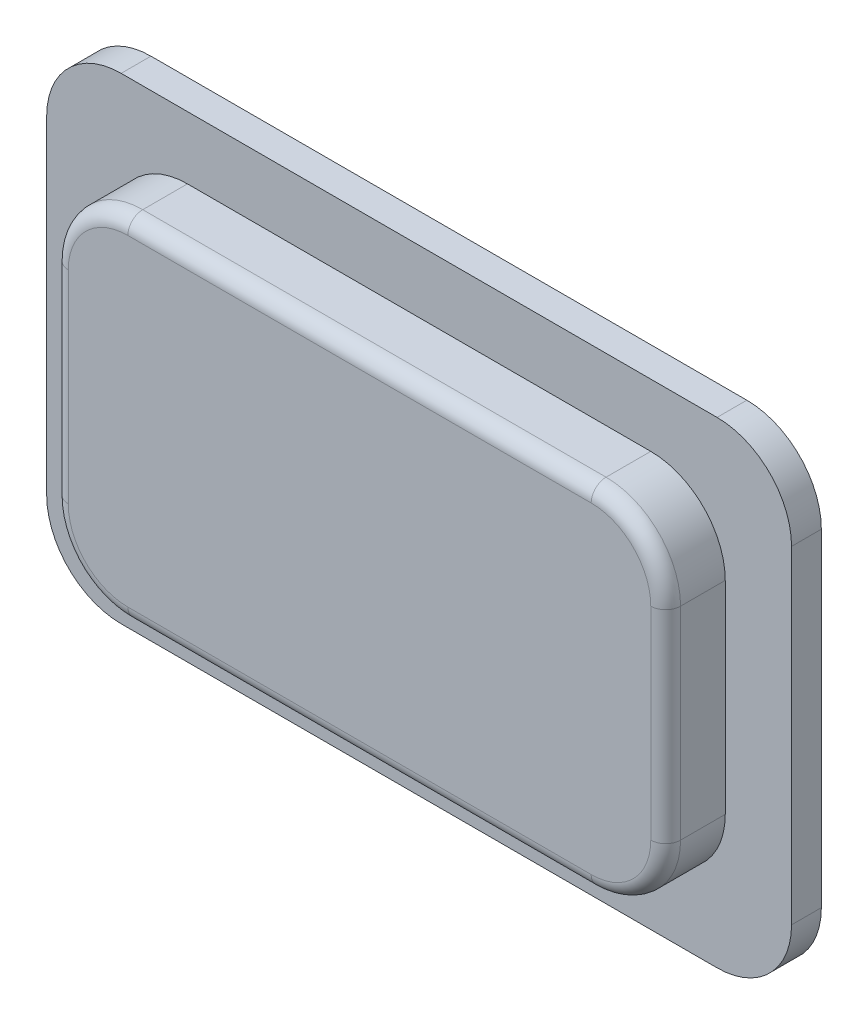
ISO-10303-21;
HEADER;
FILE_DESCRIPTION(('STEP AP214'),'2;1');
FILE_NAME('part.step','',(''),(''),'','','');
FILE_SCHEMA(('AUTOMOTIVE_DESIGN { 1 0 10303 214 1 1 1 1 }'));
ENDSEC;
DATA;
#1=APPLICATION_CONTEXT('core data for automotive mechanical design processes');
#2=APPLICATION_PROTOCOL_DEFINITION('international standard','automotive_design',2000,#1);
#3=PRODUCT_CONTEXT('',#1,'mechanical');
#4=PRODUCT('Part','Part','',(#3));
#5=PRODUCT_RELATED_PRODUCT_CATEGORY('part','',(#4));
#6=PRODUCT_DEFINITION_FORMATION('','',#4);
#7=PRODUCT_DEFINITION_CONTEXT('part definition',#1,'design');
#8=PRODUCT_DEFINITION('design','',#6,#7);
#9=PRODUCT_DEFINITION_SHAPE('','',#8);
#10=(LENGTH_UNIT() NAMED_UNIT(*) SI_UNIT(.MILLI.,.METRE.));
#11=(NAMED_UNIT(*) PLANE_ANGLE_UNIT() SI_UNIT($,.RADIAN.));
#12=(NAMED_UNIT(*) SI_UNIT($,.STERADIAN.) SOLID_ANGLE_UNIT());
#13=UNCERTAINTY_MEASURE_WITH_UNIT(LENGTH_MEASURE(1.E-05),#10,'distance_accuracy_value','');
#14=(GEOMETRIC_REPRESENTATION_CONTEXT(3) GLOBAL_UNCERTAINTY_ASSIGNED_CONTEXT((#13)) GLOBAL_UNIT_ASSIGNED_CONTEXT((#10,
#11,#12)) REPRESENTATION_CONTEXT('',''));
#15=CARTESIAN_POINT('',(0.,0.,0.));
#16=DIRECTION('',(0.,0.,1.));
#17=DIRECTION('',(1.,0.,0.));
#18=AXIS2_PLACEMENT_3D('',#15,#16,#17);
#19=CARTESIAN_POINT('',(0.,0.,0.));
#20=DIRECTION('',(0.,0.,-1.));
#21=DIRECTION('',(-1.,0.,0.));
#22=AXIS2_PLACEMENT_3D('',#19,#20,#21);
#23=PLANE('',#22);
#24=DIRECTION('',(0.,-1.,0.));
#25=VECTOR('',#24,1.);
#26=CARTESIAN_POINT('',(-12.5,-8.,0.));
#27=LINE('',#26,#25);
#28=CARTESIAN_POINT('',(-12.5,5.5,0.));
#29=VERTEX_POINT('',#28);
#30=CARTESIAN_POINT('',(-12.5,-5.5,0.));
#31=VERTEX_POINT('',#30);
#32=EDGE_CURVE('E175',#29,#31,#27,.T.);
#33=ORIENTED_EDGE('',*,*,#32,.T.);
#34=CARTESIAN_POINT('',(-10.,-5.5,0.));
#35=DIRECTION('',(0.,0.,-1.));
#36=DIRECTION('',(-1.,0.,0.));
#37=AXIS2_PLACEMENT_3D('',#34,#35,#36);
#38=CIRCLE('',#37,2.5);
#39=CARTESIAN_POINT('',(-10.,-8.,0.));
#40=VERTEX_POINT('',#39);
#41=EDGE_CURVE('E182',#31,#40,#38,.F.);
#42=ORIENTED_EDGE('',*,*,#41,.T.);
#43=DIRECTION('',(1.,0.,0.));
#44=VECTOR('',#43,1.);
#45=CARTESIAN_POINT('',(-12.5,-8.,0.));
#46=LINE('',#45,#44);
#47=CARTESIAN_POINT('',(10.,-8.,0.));
#48=VERTEX_POINT('',#47);
#49=EDGE_CURVE('E193',#40,#48,#46,.T.);
#50=ORIENTED_EDGE('',*,*,#49,.T.);
#51=CARTESIAN_POINT('',(10.,-5.5,0.));
#52=DIRECTION('',(0.,0.,-1.));
#53=DIRECTION('',(-1.,0.,0.));
#54=AXIS2_PLACEMENT_3D('',#51,#52,#53);
#55=CIRCLE('',#54,2.5);
#56=CARTESIAN_POINT('',(12.5,-5.5,0.));
#57=VERTEX_POINT('',#56);
#58=EDGE_CURVE('E200',#48,#57,#55,.F.);
#59=ORIENTED_EDGE('',*,*,#58,.T.);
#60=DIRECTION('',(0.,1.,0.));
#61=VECTOR('',#60,1.);
#62=CARTESIAN_POINT('',(12.5,-8.,0.));
#63=LINE('',#62,#61);
#64=CARTESIAN_POINT('',(12.5,5.5,0.));
#65=VERTEX_POINT('',#64);
#66=EDGE_CURVE('E327',#57,#65,#63,.T.);
#67=ORIENTED_EDGE('',*,*,#66,.T.);
#68=CARTESIAN_POINT('',(10.,5.5,0.));
#69=DIRECTION('',(0.,0.,-1.));
#70=DIRECTION('',(-1.,0.,0.));
#71=AXIS2_PLACEMENT_3D('',#68,#69,#70);
#72=CIRCLE('',#71,2.5);
#73=CARTESIAN_POINT('',(10.,8.,0.));
#74=VERTEX_POINT('',#73);
#75=EDGE_CURVE('E183',#65,#74,#72,.F.);
#76=ORIENTED_EDGE('',*,*,#75,.T.);
#77=DIRECTION('',(-1.,0.,0.));
#78=VECTOR('',#77,1.);
#79=CARTESIAN_POINT('',(-12.5,8.,0.));
#80=LINE('',#79,#78);
#81=CARTESIAN_POINT('',(-10.,8.,0.));
#82=VERTEX_POINT('',#81);
#83=EDGE_CURVE('E177',#74,#82,#80,.T.);
#84=ORIENTED_EDGE('',*,*,#83,.T.);
#85=CARTESIAN_POINT('',(-10.,5.5,0.));
#86=DIRECTION('',(0.,0.,-1.));
#87=DIRECTION('',(-1.,0.,0.));
#88=AXIS2_PLACEMENT_3D('',#85,#86,#87);
#89=CIRCLE('',#88,2.5);
#90=EDGE_CURVE('E172',#82,#29,#89,.F.);
#91=ORIENTED_EDGE('',*,*,#90,.T.);
#92=EDGE_LOOP('',(#33,#42,#50,#59,#67,#76,#84,#91));
#93=FACE_BOUND('',#92,.T.);
#94=DIRECTION('',(0.,1.,0.));
#95=VECTOR('',#94,1.);
#96=CARTESIAN_POINT('',(10.275,5.9,0.));
#97=LINE('',#96,#95);
#98=CARTESIAN_POINT('',(10.275,-3.4,0.));
#99=VERTEX_POINT('',#98);
#100=CARTESIAN_POINT('',(10.275,3.4,0.));
#101=VERTEX_POINT('',#100);
#102=EDGE_CURVE('E308',#99,#101,#97,.T.);
#103=ORIENTED_EDGE('',*,*,#102,.F.);
#104=CARTESIAN_POINT('',(7.775,-3.4,0.));
#105=DIRECTION('',(0.,0.,-1.));
#106=DIRECTION('',(-1.,0.,0.));
#107=AXIS2_PLACEMENT_3D('',#104,#105,#106);
#108=CIRCLE('',#107,2.5);
#109=CARTESIAN_POINT('',(7.775,-5.9,0.));
#110=VERTEX_POINT('',#109);
#111=EDGE_CURVE('E255',#99,#110,#108,.T.);
#112=ORIENTED_EDGE('',*,*,#111,.T.);
#113=DIRECTION('',(1.,0.,0.));
#114=VECTOR('',#113,1.);
#115=CARTESIAN_POINT('',(-10.275,-5.9,0.));
#116=LINE('',#115,#114);
#117=CARTESIAN_POINT('',(-7.775,-5.9,0.));
#118=VERTEX_POINT('',#117);
#119=EDGE_CURVE('E324',#118,#110,#116,.T.);
#120=ORIENTED_EDGE('',*,*,#119,.F.);
#121=CARTESIAN_POINT('',(-7.775,-3.4,0.));
#122=DIRECTION('',(0.,0.,-1.));
#123=DIRECTION('',(-1.,0.,0.));
#124=AXIS2_PLACEMENT_3D('',#121,#122,#123);
#125=CIRCLE('',#124,2.5);
#126=CARTESIAN_POINT('',(-10.275,-3.4,0.));
#127=VERTEX_POINT('',#126);
#128=EDGE_CURVE('E253',#118,#127,#125,.T.);
#129=ORIENTED_EDGE('',*,*,#128,.T.);
#130=DIRECTION('',(0.,-1.,0.));
#131=VECTOR('',#130,1.);
#132=CARTESIAN_POINT('',(-10.275,5.9,0.));
#133=LINE('',#132,#131);
#134=CARTESIAN_POINT('',(-10.275,3.4,0.));
#135=VERTEX_POINT('',#134);
#136=EDGE_CURVE('E319',#135,#127,#133,.T.);
#137=ORIENTED_EDGE('',*,*,#136,.F.);
#138=CARTESIAN_POINT('',(-7.775,3.4,0.));
#139=DIRECTION('',(0.,0.,-1.));
#140=DIRECTION('',(-1.,0.,0.));
#141=AXIS2_PLACEMENT_3D('',#138,#139,#140);
#142=CIRCLE('',#141,2.5);
#143=CARTESIAN_POINT('',(-7.775,5.9,0.));
#144=VERTEX_POINT('',#143);
#145=EDGE_CURVE('E251',#135,#144,#142,.T.);
#146=ORIENTED_EDGE('',*,*,#145,.T.);
#147=DIRECTION('',(-1.,0.,0.));
#148=VECTOR('',#147,1.);
#149=CARTESIAN_POINT('',(-10.275,5.9,0.));
#150=LINE('',#149,#148);
#151=CARTESIAN_POINT('',(7.775,5.9,0.));
#152=VERTEX_POINT('',#151);
#153=EDGE_CURVE('E314',#152,#144,#150,.T.);
#154=ORIENTED_EDGE('',*,*,#153,.F.);
#155=CARTESIAN_POINT('',(7.775,3.4,0.));
#156=DIRECTION('',(0.,0.,-1.));
#157=DIRECTION('',(-1.,0.,0.));
#158=AXIS2_PLACEMENT_3D('',#155,#156,#157);
#159=CIRCLE('',#158,2.5);
#160=EDGE_CURVE('E249',#152,#101,#159,.T.);
#161=ORIENTED_EDGE('',*,*,#160,.T.);
#162=EDGE_LOOP('',(#103,#112,#120,#129,#137,#146,#154,#161));
#163=FACE_BOUND('',#162,.T.);
#164=ADVANCED_FACE('F33',(#93,#163),#23,.F.);
#165=CARTESIAN_POINT('',(12.5,-8.,-1.));
#166=DIRECTION('',(1.,0.,0.));
#167=DIRECTION('',(0.,0.,-1.));
#168=AXIS2_PLACEMENT_3D('',#165,#166,#167);
#169=PLANE('',#168);
#170=DIRECTION('',(0.,1.,0.));
#171=VECTOR('',#170,1.);
#172=CARTESIAN_POINT('',(12.5,-8.,-1.));
#173=LINE('',#172,#171);
#174=CARTESIAN_POINT('',(12.5,-5.5,-1.));
#175=VERTEX_POINT('',#174);
#176=CARTESIAN_POINT('',(12.5,5.5,-1.));
#177=VERTEX_POINT('',#176);
#178=EDGE_CURVE('E328',#175,#177,#173,.T.);
#179=ORIENTED_EDGE('',*,*,#178,.T.);
#180=DIRECTION('',(0.,0.,1.));
#181=VECTOR('',#180,1.);
#182=CARTESIAN_POINT('',(12.5,5.5,-1.));
#183=LINE('',#182,#181);
#184=EDGE_CURVE('E228',#177,#65,#183,.T.);
#185=ORIENTED_EDGE('',*,*,#184,.T.);
#186=ORIENTED_EDGE('',*,*,#66,.F.);
#187=DIRECTION('',(0.,0.,1.));
#188=VECTOR('',#187,1.);
#189=CARTESIAN_POINT('',(12.5,-5.5,-1.));
#190=LINE('',#189,#188);
#191=EDGE_CURVE('E226',#57,#175,#190,.F.);
#192=ORIENTED_EDGE('',*,*,#191,.T.);
#193=EDGE_LOOP('',(#179,#185,#186,#192));
#194=FACE_BOUND('',#193,.T.);
#195=ADVANCED_FACE('F341',(#194),#169,.T.);
#196=CARTESIAN_POINT('',(-12.5,-8.,-1.));
#197=DIRECTION('',(0.,-1.,0.));
#198=DIRECTION('',(0.,0.,-1.));
#199=AXIS2_PLACEMENT_3D('',#196,#197,#198);
#200=PLANE('',#199);
#201=ORIENTED_EDGE('',*,*,#49,.F.);
#202=DIRECTION('',(0.,0.,1.));
#203=VECTOR('',#202,1.);
#204=CARTESIAN_POINT('',(-10.,-8.,-1.));
#205=LINE('',#204,#203);
#206=CARTESIAN_POINT('',(-10.,-8.,-1.));
#207=VERTEX_POINT('',#206);
#208=EDGE_CURVE('E213',#40,#207,#205,.F.);
#209=ORIENTED_EDGE('',*,*,#208,.T.);
#210=DIRECTION('',(1.,0.,0.));
#211=VECTOR('',#210,1.);
#212=CARTESIAN_POINT('',(-12.5,-8.,-1.));
#213=LINE('',#212,#211);
#214=CARTESIAN_POINT('',(10.,-8.,-1.));
#215=VERTEX_POINT('',#214);
#216=EDGE_CURVE('E198',#207,#215,#213,.T.);
#217=ORIENTED_EDGE('',*,*,#216,.T.);
#218=DIRECTION('',(0.,0.,1.));
#219=VECTOR('',#218,1.);
#220=CARTESIAN_POINT('',(10.,-8.,-1.));
#221=LINE('',#220,#219);
#222=EDGE_CURVE('E210',#215,#48,#221,.T.);
#223=ORIENTED_EDGE('',*,*,#222,.T.);
#224=EDGE_LOOP('',(#201,#209,#217,#223));
#225=FACE_BOUND('',#224,.T.);
#226=ADVANCED_FACE('F354',(#225),#200,.T.);
#227=CARTESIAN_POINT('',(-12.5,-8.,-1.));
#228=DIRECTION('',(-1.,0.,0.));
#229=DIRECTION('',(0.,0.,1.));
#230=AXIS2_PLACEMENT_3D('',#227,#228,#229);
#231=PLANE('',#230);
#232=DIRECTION('',(0.,-1.,0.));
#233=VECTOR('',#232,1.);
#234=CARTESIAN_POINT('',(-12.5,-8.,-1.));
#235=LINE('',#234,#233);
#236=CARTESIAN_POINT('',(-12.5,5.5,-1.));
#237=VERTEX_POINT('',#236);
#238=CARTESIAN_POINT('',(-12.5,-5.5,-1.));
#239=VERTEX_POINT('',#238);
#240=EDGE_CURVE('E203',#237,#239,#235,.T.);
#241=ORIENTED_EDGE('',*,*,#240,.T.);
#242=DIRECTION('',(0.,0.,1.));
#243=VECTOR('',#242,1.);
#244=CARTESIAN_POINT('',(-12.5,-5.5,-1.));
#245=LINE('',#244,#243);
#246=EDGE_CURVE('E192',#239,#31,#245,.T.);
#247=ORIENTED_EDGE('',*,*,#246,.T.);
#248=ORIENTED_EDGE('',*,*,#32,.F.);
#249=DIRECTION('',(0.,0.,1.));
#250=VECTOR('',#249,1.);
#251=CARTESIAN_POINT('',(-12.5,5.5,-1.));
#252=LINE('',#251,#250);
#253=EDGE_CURVE('E189',#29,#237,#252,.F.);
#254=ORIENTED_EDGE('',*,*,#253,.T.);
#255=EDGE_LOOP('',(#241,#247,#248,#254));
#256=FACE_BOUND('',#255,.T.);
#257=ADVANCED_FACE('F188',(#256),#231,.T.);
#258=CARTESIAN_POINT('',(-12.5,8.,-1.));
#259=DIRECTION('',(0.,1.,0.));
#260=DIRECTION('',(0.,0.,1.));
#261=AXIS2_PLACEMENT_3D('',#258,#259,#260);
#262=PLANE('',#261);
#263=DIRECTION('',(-1.,0.,0.));
#264=VECTOR('',#263,1.);
#265=CARTESIAN_POINT('',(-12.5,8.,-1.));
#266=LINE('',#265,#264);
#267=CARTESIAN_POINT('',(10.,8.,-1.));
#268=VERTEX_POINT('',#267);
#269=CARTESIAN_POINT('',(-10.,8.,-1.));
#270=VERTEX_POINT('',#269);
#271=EDGE_CURVE('E331',#268,#270,#266,.T.);
#272=ORIENTED_EDGE('',*,*,#271,.T.);
#273=DIRECTION('',(0.,0.,1.));
#274=VECTOR('',#273,1.);
#275=CARTESIAN_POINT('',(-10.,8.,-1.));
#276=LINE('',#275,#274);
#277=EDGE_CURVE('E224',#270,#82,#276,.T.);
#278=ORIENTED_EDGE('',*,*,#277,.T.);
#279=ORIENTED_EDGE('',*,*,#83,.F.);
#280=DIRECTION('',(0.,0.,1.));
#281=VECTOR('',#280,1.);
#282=CARTESIAN_POINT('',(10.,8.,-1.));
#283=LINE('',#282,#281);
#284=EDGE_CURVE('E222',#74,#268,#283,.F.);
#285=ORIENTED_EDGE('',*,*,#284,.T.);
#286=EDGE_LOOP('',(#272,#278,#279,#285));
#287=FACE_BOUND('',#286,.T.);
#288=ADVANCED_FACE('F361',(#287),#262,.T.);
#289=CARTESIAN_POINT('',(0.,0.,-1.));
#290=DIRECTION('',(0.,0.,-1.));
#291=DIRECTION('',(-1.,0.,0.));
#292=AXIS2_PLACEMENT_3D('',#289,#290,#291);
#293=PLANE('',#292);
#294=ORIENTED_EDGE('',*,*,#216,.F.);
#295=CARTESIAN_POINT('',(-10.,-5.5,-1.));
#296=DIRECTION('',(0.,0.,-1.));
#297=DIRECTION('',(-1.,0.,0.));
#298=AXIS2_PLACEMENT_3D('',#295,#296,#297);
#299=CIRCLE('',#298,2.5);
#300=EDGE_CURVE('E220',#207,#239,#299,.T.);
#301=ORIENTED_EDGE('',*,*,#300,.T.);
#302=ORIENTED_EDGE('',*,*,#240,.F.);
#303=CARTESIAN_POINT('',(-10.,5.5,-1.));
#304=DIRECTION('',(0.,0.,-1.));
#305=DIRECTION('',(-1.,0.,0.));
#306=AXIS2_PLACEMENT_3D('',#303,#304,#305);
#307=CIRCLE('',#306,2.5);
#308=EDGE_CURVE('E197',#237,#270,#307,.T.);
#309=ORIENTED_EDGE('',*,*,#308,.T.);
#310=ORIENTED_EDGE('',*,*,#271,.F.);
#311=CARTESIAN_POINT('',(10.,5.5,-1.));
#312=DIRECTION('',(0.,0.,-1.));
#313=DIRECTION('',(-1.,0.,0.));
#314=AXIS2_PLACEMENT_3D('',#311,#312,#313);
#315=CIRCLE('',#314,2.5);
#316=EDGE_CURVE('E217',#268,#177,#315,.T.);
#317=ORIENTED_EDGE('',*,*,#316,.T.);
#318=ORIENTED_EDGE('',*,*,#178,.F.);
#319=CARTESIAN_POINT('',(10.,-5.5,-1.));
#320=DIRECTION('',(0.,0.,-1.));
#321=DIRECTION('',(-1.,0.,0.));
#322=AXIS2_PLACEMENT_3D('',#319,#320,#321);
#323=CIRCLE('',#322,2.5);
#324=EDGE_CURVE('E215',#175,#215,#323,.T.);
#325=ORIENTED_EDGE('',*,*,#324,.T.);
#326=EDGE_LOOP('',(#294,#301,#302,#309,#310,#317,#318,#325));
#327=FACE_BOUND('',#326,.T.);
#328=ADVANCED_FACE('F350',(#327),#293,.T.);
#329=CARTESIAN_POINT('',(10.275,5.9,2.));
#330=DIRECTION('',(-1.,0.,0.));
#331=DIRECTION('',(0.,-1.,0.));
#332=AXIS2_PLACEMENT_3D('',#329,#330,#331);
#333=PLANE('',#332);
#334=DIRECTION('',(0.,0.,-1.));
#335=VECTOR('',#334,1.);
#336=CARTESIAN_POINT('',(10.275,3.4,2.));
#337=LINE('',#336,#335);
#338=CARTESIAN_POINT('',(10.275,3.4,1.5));
#339=VERTEX_POINT('',#338);
#340=EDGE_CURVE('E237',#101,#339,#337,.F.);
#341=ORIENTED_EDGE('',*,*,#340,.T.);
#342=DIRECTION('',(0.,1.,0.));
#343=VECTOR('',#342,1.);
#344=CARTESIAN_POINT('',(10.275,-3.4,1.5));
#345=LINE('',#344,#343);
#346=CARTESIAN_POINT('',(10.275,-3.4,1.5));
#347=VERTEX_POINT('',#346);
#348=EDGE_CURVE('E11',#339,#347,#345,.F.);
#349=ORIENTED_EDGE('',*,*,#348,.T.);
#350=DIRECTION('',(0.,0.,-1.));
#351=VECTOR('',#350,1.);
#352=CARTESIAN_POINT('',(10.275,-3.4,2.));
#353=LINE('',#352,#351);
#354=EDGE_CURVE('E235',#347,#99,#353,.T.);
#355=ORIENTED_EDGE('',*,*,#354,.T.);
#356=ORIENTED_EDGE('',*,*,#102,.T.);
#357=EDGE_LOOP('',(#341,#349,#355,#356));
#358=FACE_BOUND('',#357,.T.);
#359=ADVANCED_FACE('F409',(#358),#333,.F.);
#360=CARTESIAN_POINT('',(-10.275,5.9,2.));
#361=DIRECTION('',(0.,-1.,0.));
#362=DIRECTION('',(0.,0.,-1.));
#363=AXIS2_PLACEMENT_3D('',#360,#361,#362);
#364=PLANE('',#363);
#365=DIRECTION('',(0.,0.,-1.));
#366=VECTOR('',#365,1.);
#367=CARTESIAN_POINT('',(-7.775,5.9,2.));
#368=LINE('',#367,#366);
#369=CARTESIAN_POINT('',(-7.775,5.9,1.5));
#370=VERTEX_POINT('',#369);
#371=EDGE_CURVE('E231',#144,#370,#368,.F.);
#372=ORIENTED_EDGE('',*,*,#371,.T.);
#373=DIRECTION('',(-1.,0.,0.));
#374=VECTOR('',#373,1.);
#375=CARTESIAN_POINT('',(7.775,5.9,1.5));
#376=LINE('',#375,#374);
#377=CARTESIAN_POINT('',(7.775,5.9,1.5));
#378=VERTEX_POINT('',#377);
#379=EDGE_CURVE('E57',#370,#378,#376,.F.);
#380=ORIENTED_EDGE('',*,*,#379,.T.);
#381=DIRECTION('',(0.,0.,-1.));
#382=VECTOR('',#381,1.);
#383=CARTESIAN_POINT('',(7.775,5.9,2.));
#384=LINE('',#383,#382);
#385=EDGE_CURVE('E233',#378,#152,#384,.T.);
#386=ORIENTED_EDGE('',*,*,#385,.T.);
#387=ORIENTED_EDGE('',*,*,#153,.T.);
#388=EDGE_LOOP('',(#372,#380,#386,#387));
#389=FACE_BOUND('',#388,.T.);
#390=ADVANCED_FACE('F406',(#389),#364,.F.);
#391=CARTESIAN_POINT('',(-10.275,5.9,2.));
#392=DIRECTION('',(1.,0.,0.));
#393=DIRECTION('',(0.,1.,0.));
#394=AXIS2_PLACEMENT_3D('',#391,#392,#393);
#395=PLANE('',#394);
#396=DIRECTION('',(0.,0.,-1.));
#397=VECTOR('',#396,1.);
#398=CARTESIAN_POINT('',(-10.275,-3.4,2.));
#399=LINE('',#398,#397);
#400=CARTESIAN_POINT('',(-10.275,-3.4,1.5));
#401=VERTEX_POINT('',#400);
#402=EDGE_CURVE('E239',#127,#401,#399,.F.);
#403=ORIENTED_EDGE('',*,*,#402,.T.);
#404=DIRECTION('',(0.,-1.,0.));
#405=VECTOR('',#404,1.);
#406=CARTESIAN_POINT('',(-10.275,3.4,1.5));
#407=LINE('',#406,#405);
#408=CARTESIAN_POINT('',(-10.275,3.4,1.5));
#409=VERTEX_POINT('',#408);
#410=EDGE_CURVE('E281',#401,#409,#407,.F.);
#411=ORIENTED_EDGE('',*,*,#410,.T.);
#412=DIRECTION('',(0.,0.,-1.));
#413=VECTOR('',#412,1.);
#414=CARTESIAN_POINT('',(-10.275,3.4,2.));
#415=LINE('',#414,#413);
#416=EDGE_CURVE('E242',#409,#135,#415,.T.);
#417=ORIENTED_EDGE('',*,*,#416,.T.);
#418=ORIENTED_EDGE('',*,*,#136,.T.);
#419=EDGE_LOOP('',(#403,#411,#417,#418));
#420=FACE_BOUND('',#419,.T.);
#421=ADVANCED_FACE('F400',(#420),#395,.F.);
#422=CARTESIAN_POINT('',(-10.275,-5.9,2.));
#423=DIRECTION('',(0.,1.,0.));
#424=DIRECTION('',(0.,0.,1.));
#425=AXIS2_PLACEMENT_3D('',#422,#423,#424);
#426=PLANE('',#425);
#427=DIRECTION('',(0.,0.,-1.));
#428=VECTOR('',#427,1.);
#429=CARTESIAN_POINT('',(7.775,-5.9,2.));
#430=LINE('',#429,#428);
#431=CARTESIAN_POINT('',(7.775,-5.9,1.5));
#432=VERTEX_POINT('',#431);
#433=EDGE_CURVE('E244',#110,#432,#430,.F.);
#434=ORIENTED_EDGE('',*,*,#433,.T.);
#435=DIRECTION('',(1.,0.,0.));
#436=VECTOR('',#435,1.);
#437=CARTESIAN_POINT('',(-7.775,-5.9,1.5));
#438=LINE('',#437,#436);
#439=CARTESIAN_POINT('',(-7.775,-5.9,1.5));
#440=VERTEX_POINT('',#439);
#441=EDGE_CURVE('E277',#432,#440,#438,.F.);
#442=ORIENTED_EDGE('',*,*,#441,.T.);
#443=DIRECTION('',(0.,0.,-1.));
#444=VECTOR('',#443,1.);
#445=CARTESIAN_POINT('',(-7.775,-5.9,2.));
#446=LINE('',#445,#444);
#447=EDGE_CURVE('E247',#440,#118,#446,.T.);
#448=ORIENTED_EDGE('',*,*,#447,.T.);
#449=ORIENTED_EDGE('',*,*,#119,.T.);
#450=EDGE_LOOP('',(#434,#442,#448,#449));
#451=FACE_BOUND('',#450,.T.);
#452=ADVANCED_FACE('F394',(#451),#426,.F.);
#453=CARTESIAN_POINT('',(0.,0.,2.));
#454=DIRECTION('',(0.,0.,1.));
#455=DIRECTION('',(1.,0.,0.));
#456=AXIS2_PLACEMENT_3D('',#453,#454,#455);
#457=PLANE('',#456);
#458=DIRECTION('',(1.,0.,0.));
#459=VECTOR('',#458,1.);
#460=CARTESIAN_POINT('',(7.775,-5.4,2.));
#461=LINE('',#460,#459);
#462=CARTESIAN_POINT('',(-7.775,-5.4,2.));
#463=VERTEX_POINT('',#462);
#464=CARTESIAN_POINT('',(7.775,-5.4,2.));
#465=VERTEX_POINT('',#464);
#466=EDGE_CURVE('E269',#463,#465,#461,.T.);
#467=ORIENTED_EDGE('',*,*,#466,.T.);
#468=CARTESIAN_POINT('',(7.775,-3.4,2.));
#469=DIRECTION('',(0.,0.,1.));
#470=DIRECTION('',(1.,0.,0.));
#471=AXIS2_PLACEMENT_3D('',#468,#469,#470);
#472=CIRCLE('',#471,2.);
#473=CARTESIAN_POINT('',(9.775,-3.4,2.));
#474=VERTEX_POINT('',#473);
#475=EDGE_CURVE('E271',#465,#474,#472,.T.);
#476=ORIENTED_EDGE('',*,*,#475,.T.);
#477=DIRECTION('',(0.,1.,0.));
#478=VECTOR('',#477,1.);
#479=CARTESIAN_POINT('',(9.775,3.4,2.));
#480=LINE('',#479,#478);
#481=CARTESIAN_POINT('',(9.775,3.4,2.));
#482=VERTEX_POINT('',#481);
#483=EDGE_CURVE('E257',#474,#482,#480,.T.);
#484=ORIENTED_EDGE('',*,*,#483,.T.);
#485=CARTESIAN_POINT('',(7.775,3.4,2.));
#486=DIRECTION('',(0.,0.,1.));
#487=DIRECTION('',(1.,0.,0.));
#488=AXIS2_PLACEMENT_3D('',#485,#486,#487);
#489=CIRCLE('',#488,2.);
#490=CARTESIAN_POINT('',(7.775,5.4,2.));
#491=VERTEX_POINT('',#490);
#492=EDGE_CURVE('E259',#482,#491,#489,.T.);
#493=ORIENTED_EDGE('',*,*,#492,.T.);
#494=DIRECTION('',(-1.,0.,0.));
#495=VECTOR('',#494,1.);
#496=CARTESIAN_POINT('',(-7.775,5.4,2.));
#497=LINE('',#496,#495);
#498=CARTESIAN_POINT('',(-7.775,5.4,2.));
#499=VERTEX_POINT('',#498);
#500=EDGE_CURVE('E261',#491,#499,#497,.T.);
#501=ORIENTED_EDGE('',*,*,#500,.T.);
#502=CARTESIAN_POINT('',(-7.775,3.4,2.));
#503=DIRECTION('',(0.,0.,1.));
#504=DIRECTION('',(1.,0.,0.));
#505=AXIS2_PLACEMENT_3D('',#502,#503,#504);
#506=CIRCLE('',#505,2.);
#507=CARTESIAN_POINT('',(-9.775,3.4,2.));
#508=VERTEX_POINT('',#507);
#509=EDGE_CURVE('E263',#499,#508,#506,.T.);
#510=ORIENTED_EDGE('',*,*,#509,.T.);
#511=DIRECTION('',(0.,-1.,0.));
#512=VECTOR('',#511,1.);
#513=CARTESIAN_POINT('',(-9.775,-3.4,2.));
#514=LINE('',#513,#512);
#515=CARTESIAN_POINT('',(-9.775,-3.4,2.));
#516=VERTEX_POINT('',#515);
#517=EDGE_CURVE('E265',#508,#516,#514,.T.);
#518=ORIENTED_EDGE('',*,*,#517,.T.);
#519=CARTESIAN_POINT('',(-7.775,-3.4,2.));
#520=DIRECTION('',(0.,0.,1.));
#521=DIRECTION('',(1.,0.,0.));
#522=AXIS2_PLACEMENT_3D('',#519,#520,#521);
#523=CIRCLE('',#522,2.);
#524=EDGE_CURVE('E267',#516,#463,#523,.T.);
#525=ORIENTED_EDGE('',*,*,#524,.T.);
#526=EDGE_LOOP('',(#467,#476,#484,#493,#501,#510,#518,#525));
#527=FACE_BOUND('',#526,.T.);
#528=ADVANCED_FACE('F390',(#527),#457,.T.);
#529=CARTESIAN_POINT('',(-10.,-5.5,-1.));
#530=DIRECTION('',(0.,0.,1.));
#531=DIRECTION('',(1.,0.,0.));
#532=AXIS2_PLACEMENT_3D('',#529,#530,#531);
#533=CYLINDRICAL_SURFACE('',#532,2.5);
#534=ORIENTED_EDGE('',*,*,#300,.F.);
#535=ORIENTED_EDGE('',*,*,#208,.F.);
#536=ORIENTED_EDGE('',*,*,#41,.F.);
#537=ORIENTED_EDGE('',*,*,#246,.F.);
#538=EDGE_LOOP('',(#534,#535,#536,#537));
#539=FACE_BOUND('',#538,.T.);
#540=ADVANCED_FACE('F357',(#539),#533,.T.);
#541=CARTESIAN_POINT('',(-10.,5.5,-1.));
#542=DIRECTION('',(0.,0.,1.));
#543=DIRECTION('',(1.,0.,0.));
#544=AXIS2_PLACEMENT_3D('',#541,#542,#543);
#545=CYLINDRICAL_SURFACE('',#544,2.5);
#546=ORIENTED_EDGE('',*,*,#308,.F.);
#547=ORIENTED_EDGE('',*,*,#253,.F.);
#548=ORIENTED_EDGE('',*,*,#90,.F.);
#549=ORIENTED_EDGE('',*,*,#277,.F.);
#550=EDGE_LOOP('',(#546,#547,#548,#549));
#551=FACE_BOUND('',#550,.T.);
#552=ADVANCED_FACE('F196',(#551),#545,.T.);
#553=CARTESIAN_POINT('',(10.,5.5,-1.));
#554=DIRECTION('',(0.,0.,1.));
#555=DIRECTION('',(1.,0.,0.));
#556=AXIS2_PLACEMENT_3D('',#553,#554,#555);
#557=CYLINDRICAL_SURFACE('',#556,2.5);
#558=ORIENTED_EDGE('',*,*,#316,.F.);
#559=ORIENTED_EDGE('',*,*,#284,.F.);
#560=ORIENTED_EDGE('',*,*,#75,.F.);
#561=ORIENTED_EDGE('',*,*,#184,.F.);
#562=EDGE_LOOP('',(#558,#559,#560,#561));
#563=FACE_BOUND('',#562,.T.);
#564=ADVANCED_FACE('F364',(#563),#557,.T.);
#565=CARTESIAN_POINT('',(10.,-5.5,-1.));
#566=DIRECTION('',(0.,0.,1.));
#567=DIRECTION('',(1.,0.,0.));
#568=AXIS2_PLACEMENT_3D('',#565,#566,#567);
#569=CYLINDRICAL_SURFACE('',#568,2.5);
#570=ORIENTED_EDGE('',*,*,#324,.F.);
#571=ORIENTED_EDGE('',*,*,#191,.F.);
#572=ORIENTED_EDGE('',*,*,#58,.F.);
#573=ORIENTED_EDGE('',*,*,#222,.F.);
#574=EDGE_LOOP('',(#570,#571,#572,#573));
#575=FACE_BOUND('',#574,.T.);
#576=ADVANCED_FACE('F346',(#575),#569,.T.);
#577=CARTESIAN_POINT('',(7.775,3.4,2.));
#578=DIRECTION('',(0.,0.,-1.));
#579=DIRECTION('',(-1.,0.,0.));
#580=AXIS2_PLACEMENT_3D('',#577,#578,#579);
#581=CYLINDRICAL_SURFACE('',#580,2.5);
#582=ORIENTED_EDGE('',*,*,#385,.F.);
#583=CARTESIAN_POINT('',(7.775,3.4,1.5));
#584=DIRECTION('',(0.,0.,1.));
#585=DIRECTION('',(1.,0.,0.));
#586=AXIS2_PLACEMENT_3D('',#583,#584,#585);
#587=CIRCLE('',#586,2.5);
#588=EDGE_CURVE('E42',#378,#339,#587,.F.);
#589=ORIENTED_EDGE('',*,*,#588,.T.);
#590=ORIENTED_EDGE('',*,*,#340,.F.);
#591=ORIENTED_EDGE('',*,*,#160,.F.);
#592=EDGE_LOOP('',(#582,#589,#590,#591));
#593=FACE_BOUND('',#592,.T.);
#594=ADVANCED_FACE('F371',(#593),#581,.T.);
#595=CARTESIAN_POINT('',(-7.775,3.4,2.));
#596=DIRECTION('',(0.,0.,-1.));
#597=DIRECTION('',(-1.,0.,0.));
#598=AXIS2_PLACEMENT_3D('',#595,#596,#597);
#599=CYLINDRICAL_SURFACE('',#598,2.5);
#600=ORIENTED_EDGE('',*,*,#416,.F.);
#601=CARTESIAN_POINT('',(-7.775,3.4,1.5));
#602=DIRECTION('',(0.,0.,1.));
#603=DIRECTION('',(1.,0.,0.));
#604=AXIS2_PLACEMENT_3D('',#601,#602,#603);
#605=CIRCLE('',#604,2.5);
#606=EDGE_CURVE('E283',#409,#370,#605,.F.);
#607=ORIENTED_EDGE('',*,*,#606,.T.);
#608=ORIENTED_EDGE('',*,*,#371,.F.);
#609=ORIENTED_EDGE('',*,*,#145,.F.);
#610=EDGE_LOOP('',(#600,#607,#608,#609));
#611=FACE_BOUND('',#610,.T.);
#612=ADVANCED_FACE('F480',(#611),#599,.T.);
#613=CARTESIAN_POINT('',(-7.775,-3.4,2.));
#614=DIRECTION('',(0.,0.,-1.));
#615=DIRECTION('',(-1.,0.,0.));
#616=AXIS2_PLACEMENT_3D('',#613,#614,#615);
#617=CYLINDRICAL_SURFACE('',#616,2.5);
#618=ORIENTED_EDGE('',*,*,#447,.F.);
#619=CARTESIAN_POINT('',(-7.775,-3.4,1.5));
#620=DIRECTION('',(0.,0.,1.));
#621=DIRECTION('',(1.,0.,0.));
#622=AXIS2_PLACEMENT_3D('',#619,#620,#621);
#623=CIRCLE('',#622,2.5);
#624=EDGE_CURVE('E279',#440,#401,#623,.F.);
#625=ORIENTED_EDGE('',*,*,#624,.T.);
#626=ORIENTED_EDGE('',*,*,#402,.F.);
#627=ORIENTED_EDGE('',*,*,#128,.F.);
#628=EDGE_LOOP('',(#618,#625,#626,#627));
#629=FACE_BOUND('',#628,.T.);
#630=ADVANCED_FACE('F475',(#629),#617,.T.);
#631=CARTESIAN_POINT('',(7.775,-3.4,2.));
#632=DIRECTION('',(0.,0.,-1.));
#633=DIRECTION('',(-1.,0.,0.));
#634=AXIS2_PLACEMENT_3D('',#631,#632,#633);
#635=CYLINDRICAL_SURFACE('',#634,2.5);
#636=ORIENTED_EDGE('',*,*,#354,.F.);
#637=CARTESIAN_POINT('',(7.775,-3.4,1.5));
#638=DIRECTION('',(0.,0.,1.));
#639=DIRECTION('',(1.,0.,0.));
#640=AXIS2_PLACEMENT_3D('',#637,#638,#639);
#641=CIRCLE('',#640,2.5);
#642=EDGE_CURVE('E274',#347,#432,#641,.F.);
#643=ORIENTED_EDGE('',*,*,#642,.T.);
#644=ORIENTED_EDGE('',*,*,#433,.F.);
#645=ORIENTED_EDGE('',*,*,#111,.F.);
#646=EDGE_LOOP('',(#636,#643,#644,#645));
#647=FACE_BOUND('',#646,.T.);
#648=ADVANCED_FACE('F433',(#647),#635,.T.);
#649=CARTESIAN_POINT('',(-7.775,3.4,1.5));
#650=DIRECTION('',(0.,0.,1.));
#651=DIRECTION('',(1.,0.,0.));
#652=AXIS2_PLACEMENT_3D('',#649,#650,#651);
#653=TOROIDAL_SURFACE('',#652,2.,0.5);
#654=CARTESIAN_POINT('',(-7.775,5.4,1.5));
#655=DIRECTION('',(1.,0.,0.));
#656=DIRECTION('',(0.,0.,-1.));
#657=AXIS2_PLACEMENT_3D('',#654,#655,#656);
#658=CIRCLE('',#657,0.5);
#659=EDGE_CURVE('E302',#370,#499,#658,.T.);
#660=ORIENTED_EDGE('',*,*,#659,.F.);
#661=ORIENTED_EDGE('',*,*,#606,.F.);
#662=CARTESIAN_POINT('',(-9.775,3.4,1.5));
#663=DIRECTION('',(0.,-1.,0.));
#664=DIRECTION('',(0.,0.,-1.));
#665=AXIS2_PLACEMENT_3D('',#662,#663,#664);
#666=CIRCLE('',#665,0.5);
#667=EDGE_CURVE('E37',#508,#409,#666,.T.);
#668=ORIENTED_EDGE('',*,*,#667,.F.);
#669=ORIENTED_EDGE('',*,*,#509,.F.);
#670=EDGE_LOOP('',(#660,#661,#668,#669));
#671=FACE_BOUND('',#670,.T.);
#672=ADVANCED_FACE('F35',(#671),#653,.T.);
#673=CARTESIAN_POINT('',(-9.775,0.,1.5));
#674=DIRECTION('',(0.,1.,0.));
#675=DIRECTION('',(-1.,0.,0.));
#676=AXIS2_PLACEMENT_3D('',#673,#674,#675);
#677=CYLINDRICAL_SURFACE('',#676,0.5);
#678=ORIENTED_EDGE('',*,*,#667,.T.);
#679=ORIENTED_EDGE('',*,*,#410,.F.);
#680=CARTESIAN_POINT('',(-9.775,-3.4,1.5));
#681=DIRECTION('',(0.,-1.,0.));
#682=DIRECTION('',(1.,0.,0.));
#683=AXIS2_PLACEMENT_3D('',#680,#681,#682);
#684=CIRCLE('',#683,0.5);
#685=EDGE_CURVE('E300',#516,#401,#684,.T.);
#686=ORIENTED_EDGE('',*,*,#685,.F.);
#687=ORIENTED_EDGE('',*,*,#517,.F.);
#688=EDGE_LOOP('',(#678,#679,#686,#687));
#689=FACE_BOUND('',#688,.T.);
#690=ADVANCED_FACE('F446',(#689),#677,.T.);
#691=CARTESIAN_POINT('',(0.,5.4,1.5));
#692=DIRECTION('',(1.,0.,0.));
#693=DIRECTION('',(0.,0.,-1.));
#694=AXIS2_PLACEMENT_3D('',#691,#692,#693);
#695=CYLINDRICAL_SURFACE('',#694,0.5);
#696=ORIENTED_EDGE('',*,*,#659,.T.);
#697=ORIENTED_EDGE('',*,*,#500,.F.);
#698=CARTESIAN_POINT('',(7.775,5.4,1.5));
#699=DIRECTION('',(1.,0.,0.));
#700=DIRECTION('',(0.,0.,-1.));
#701=AXIS2_PLACEMENT_3D('',#698,#699,#700);
#702=CIRCLE('',#701,0.5);
#703=EDGE_CURVE('E297',#378,#491,#702,.T.);
#704=ORIENTED_EDGE('',*,*,#703,.F.);
#705=ORIENTED_EDGE('',*,*,#379,.F.);
#706=EDGE_LOOP('',(#696,#697,#704,#705));
#707=FACE_BOUND('',#706,.T.);
#708=ADVANCED_FACE('F441',(#707),#695,.T.);
#709=CARTESIAN_POINT('',(-7.775,-3.4,1.5));
#710=DIRECTION('',(0.,0.,1.));
#711=DIRECTION('',(1.,0.,0.));
#712=AXIS2_PLACEMENT_3D('',#709,#710,#711);
#713=TOROIDAL_SURFACE('',#712,2.,0.5);
#714=ORIENTED_EDGE('',*,*,#685,.T.);
#715=ORIENTED_EDGE('',*,*,#624,.F.);
#716=CARTESIAN_POINT('',(-7.775,-5.4,1.5));
#717=DIRECTION('',(1.,0.,0.));
#718=DIRECTION('',(0.,0.,-1.));
#719=AXIS2_PLACEMENT_3D('',#716,#717,#718);
#720=CIRCLE('',#719,0.5);
#721=EDGE_CURVE('E294',#463,#440,#720,.T.);
#722=ORIENTED_EDGE('',*,*,#721,.F.);
#723=ORIENTED_EDGE('',*,*,#524,.F.);
#724=EDGE_LOOP('',(#714,#715,#722,#723));
#725=FACE_BOUND('',#724,.T.);
#726=ADVANCED_FACE('F452',(#725),#713,.T.);
#727=CARTESIAN_POINT('',(7.775,3.4,1.5));
#728=DIRECTION('',(0.,0.,1.));
#729=DIRECTION('',(1.,0.,0.));
#730=AXIS2_PLACEMENT_3D('',#727,#728,#729);
#731=TOROIDAL_SURFACE('',#730,2.,0.5);
#732=ORIENTED_EDGE('',*,*,#703,.T.);
#733=ORIENTED_EDGE('',*,*,#492,.F.);
#734=CARTESIAN_POINT('',(9.775,3.4,1.5));
#735=DIRECTION('',(0.,-1.,0.));
#736=DIRECTION('',(0.,0.,-1.));
#737=AXIS2_PLACEMENT_3D('',#734,#735,#736);
#738=CIRCLE('',#737,0.5);
#739=EDGE_CURVE('E291',#339,#482,#738,.T.);
#740=ORIENTED_EDGE('',*,*,#739,.F.);
#741=ORIENTED_EDGE('',*,*,#588,.F.);
#742=EDGE_LOOP('',(#732,#733,#740,#741));
#743=FACE_BOUND('',#742,.T.);
#744=ADVANCED_FACE('F420',(#743),#731,.T.);
#745=CARTESIAN_POINT('',(0.,-5.4,1.5));
#746=DIRECTION('',(-1.,0.,0.));
#747=DIRECTION('',(0.,0.,1.));
#748=AXIS2_PLACEMENT_3D('',#745,#746,#747);
#749=CYLINDRICAL_SURFACE('',#748,0.5);
#750=ORIENTED_EDGE('',*,*,#721,.T.);
#751=ORIENTED_EDGE('',*,*,#441,.F.);
#752=CARTESIAN_POINT('',(7.775,-5.4,1.5));
#753=DIRECTION('',(1.,0.,0.));
#754=DIRECTION('',(0.,0.,-1.));
#755=AXIS2_PLACEMENT_3D('',#752,#753,#754);
#756=CIRCLE('',#755,0.5);
#757=EDGE_CURVE('E289',#465,#432,#756,.T.);
#758=ORIENTED_EDGE('',*,*,#757,.F.);
#759=ORIENTED_EDGE('',*,*,#466,.F.);
#760=EDGE_LOOP('',(#750,#751,#758,#759));
#761=FACE_BOUND('',#760,.T.);
#762=ADVANCED_FACE('F454',(#761),#749,.T.);
#763=CARTESIAN_POINT('',(9.775,0.,1.5));
#764=DIRECTION('',(0.,-1.,0.));
#765=DIRECTION('',(1.,0.,0.));
#766=AXIS2_PLACEMENT_3D('',#763,#764,#765);
#767=CYLINDRICAL_SURFACE('',#766,0.5);
#768=ORIENTED_EDGE('',*,*,#739,.T.);
#769=ORIENTED_EDGE('',*,*,#483,.F.);
#770=CARTESIAN_POINT('',(9.775,-3.4,1.5));
#771=DIRECTION('',(0.,-1.,0.));
#772=DIRECTION('',(0.,0.,-1.));
#773=AXIS2_PLACEMENT_3D('',#770,#771,#772);
#774=CIRCLE('',#773,0.5);
#775=EDGE_CURVE('E287',#347,#474,#774,.T.);
#776=ORIENTED_EDGE('',*,*,#775,.F.);
#777=ORIENTED_EDGE('',*,*,#348,.F.);
#778=EDGE_LOOP('',(#768,#769,#776,#777));
#779=FACE_BOUND('',#778,.T.);
#780=ADVANCED_FACE('F424',(#779),#767,.T.);
#781=CARTESIAN_POINT('',(7.775,-3.4,1.5));
#782=DIRECTION('',(0.,0.,1.));
#783=DIRECTION('',(1.,0.,0.));
#784=AXIS2_PLACEMENT_3D('',#781,#782,#783);
#785=TOROIDAL_SURFACE('',#784,2.,0.5);
#786=ORIENTED_EDGE('',*,*,#757,.T.);
#787=ORIENTED_EDGE('',*,*,#642,.F.);
#788=ORIENTED_EDGE('',*,*,#775,.T.);
#789=ORIENTED_EDGE('',*,*,#475,.F.);
#790=EDGE_LOOP('',(#786,#787,#788,#789));
#791=FACE_BOUND('',#790,.T.);
#792=ADVANCED_FACE('F428',(#791),#785,.T.);
#793=CLOSED_SHELL('',(#164,#195,#226,#257,#288,#328,#359,#390,#421,#452,#528,#540,#552,#564,
#576,#594,#612,#630,#648,#672,#690,#708,#726,#744,#762,#780,#792));
#794=MANIFOLD_SOLID_BREP('B2',#793);
#795=ADVANCED_BREP_SHAPE_REPRESENTATION('',(#18,#794),#14);
#796=SHAPE_DEFINITION_REPRESENTATION(#9,#795);
ENDSEC;
END-ISO-10303-21;
